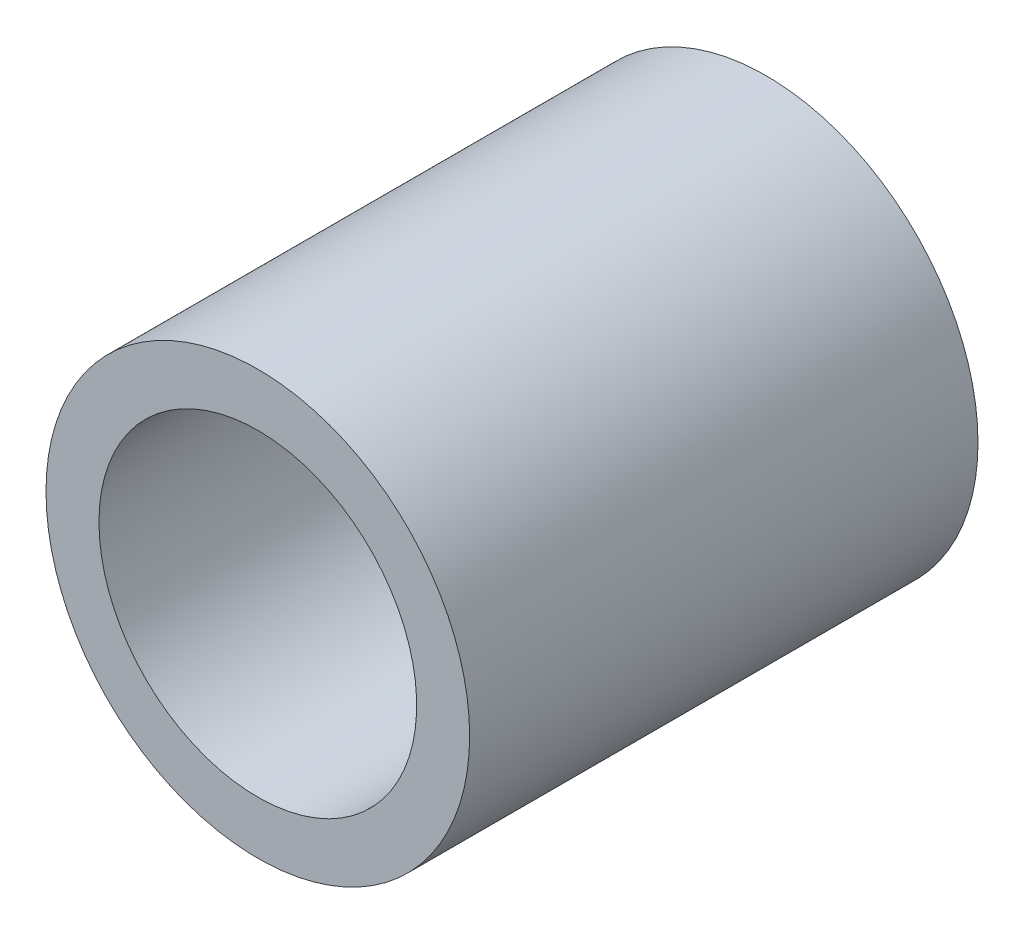
ISO-10303-21;
HEADER;
FILE_DESCRIPTION(('STEP AP214'),'2;1');
FILE_NAME('part.step','',(''),(''),'','','');
FILE_SCHEMA(('AUTOMOTIVE_DESIGN { 1 0 10303 214 1 1 1 1 }'));
ENDSEC;
DATA;
#1=APPLICATION_CONTEXT('core data for automotive mechanical design processes');
#2=APPLICATION_PROTOCOL_DEFINITION('international standard','automotive_design',2000,#1);
#3=PRODUCT_CONTEXT('',#1,'mechanical');
#4=PRODUCT('Part','Part','',(#3));
#5=PRODUCT_RELATED_PRODUCT_CATEGORY('part','',(#4));
#6=PRODUCT_DEFINITION_FORMATION('','',#4);
#7=PRODUCT_DEFINITION_CONTEXT('part definition',#1,'design');
#8=PRODUCT_DEFINITION('design','',#6,#7);
#9=PRODUCT_DEFINITION_SHAPE('','',#8);
#10=(LENGTH_UNIT() NAMED_UNIT(*) SI_UNIT(.MILLI.,.METRE.));
#11=(NAMED_UNIT(*) PLANE_ANGLE_UNIT() SI_UNIT($,.RADIAN.));
#12=(NAMED_UNIT(*) SI_UNIT($,.STERADIAN.) SOLID_ANGLE_UNIT());
#13=UNCERTAINTY_MEASURE_WITH_UNIT(LENGTH_MEASURE(1.E-05),#10,'distance_accuracy_value','');
#14=(GEOMETRIC_REPRESENTATION_CONTEXT(3) GLOBAL_UNCERTAINTY_ASSIGNED_CONTEXT((#13)) GLOBAL_UNIT_ASSIGNED_CONTEXT((#10,
#11,#12)) REPRESENTATION_CONTEXT('',''));
#15=CARTESIAN_POINT('',(0.,0.,0.));
#16=DIRECTION('',(0.,0.,1.));
#17=DIRECTION('',(1.,0.,0.));
#18=AXIS2_PLACEMENT_3D('',#15,#16,#17);
#19=CARTESIAN_POINT('',(0.,0.,6.096));
#20=DIRECTION('',(0.,0.,1.));
#21=DIRECTION('',(1.,0.,0.));
#22=AXIS2_PLACEMENT_3D('',#19,#20,#21);
#23=PLANE('',#22);
#24=CARTESIAN_POINT('',(0.,0.,6.096));
#25=DIRECTION('',(0.,0.,1.));
#26=DIRECTION('',(1.,0.,0.));
#27=AXIS2_PLACEMENT_3D('',#24,#25,#26);
#28=CIRCLE('',#27,2.54);
#29=CARTESIAN_POINT('',(-2.54,0.,6.096));
#30=VERTEX_POINT('',#29);
#31=EDGE_CURVE('E10',#30,#30,#28,.T.);
#32=ORIENTED_EDGE('',*,*,#31,.T.);
#33=EDGE_LOOP('',(#32));
#34=FACE_BOUND('',#33,.T.);
#35=CARTESIAN_POINT('',(0.,0.,6.096));
#36=DIRECTION('',(0.,0.,1.));
#37=DIRECTION('',(1.,0.,0.));
#38=AXIS2_PLACEMENT_3D('',#35,#36,#37);
#39=CIRCLE('',#38,1.905);
#40=CARTESIAN_POINT('',(-1.905,0.,6.096));
#41=VERTEX_POINT('',#40);
#42=EDGE_CURVE('E48',#41,#41,#39,.T.);
#43=ORIENTED_EDGE('',*,*,#42,.F.);
#44=EDGE_LOOP('',(#43));
#45=FACE_BOUND('',#44,.T.);
#46=ADVANCED_FACE('F35',(#34,#45),#23,.T.);
#47=CARTESIAN_POINT('',(0.,0.,0.));
#48=DIRECTION('',(0.,0.,1.));
#49=DIRECTION('',(1.,0.,0.));
#50=AXIS2_PLACEMENT_3D('',#47,#48,#49);
#51=PLANE('',#50);
#52=CARTESIAN_POINT('',(0.,0.,0.));
#53=DIRECTION('',(0.,0.,1.));
#54=DIRECTION('',(1.,0.,0.));
#55=AXIS2_PLACEMENT_3D('',#52,#53,#54);
#56=CIRCLE('',#55,2.54);
#57=CARTESIAN_POINT('',(-2.54,0.,0.));
#58=VERTEX_POINT('',#57);
#59=EDGE_CURVE('E39',#58,#58,#56,.T.);
#60=ORIENTED_EDGE('',*,*,#59,.F.);
#61=EDGE_LOOP('',(#60));
#62=FACE_BOUND('',#61,.T.);
#63=CARTESIAN_POINT('',(0.,0.,0.));
#64=DIRECTION('',(0.,0.,1.));
#65=DIRECTION('',(1.,0.,0.));
#66=AXIS2_PLACEMENT_3D('',#63,#64,#65);
#67=CIRCLE('',#66,1.905);
#68=CARTESIAN_POINT('',(-1.905,0.,0.));
#69=VERTEX_POINT('',#68);
#70=EDGE_CURVE('E50',#69,#69,#67,.T.);
#71=ORIENTED_EDGE('',*,*,#70,.T.);
#72=EDGE_LOOP('',(#71));
#73=FACE_BOUND('',#72,.T.);
#74=ADVANCED_FACE('F62',(#62,#73),#51,.F.);
#75=CARTESIAN_POINT('',(0.,0.,6.096));
#76=DIRECTION('',(0.,0.,-1.));
#77=DIRECTION('',(-1.,0.,0.));
#78=AXIS2_PLACEMENT_3D('',#75,#76,#77);
#79=CYLINDRICAL_SURFACE('',#78,2.54);
#80=CARTESIAN_POINT('',(-2.54,0.,6.096));
#81=CARTESIAN_POINT('',(-2.54,0.,6.0325));
#82=CARTESIAN_POINT('',(-2.54,0.,5.969));
#83=CARTESIAN_POINT('',(-2.54,0.,5.842));
#84=CARTESIAN_POINT('',(-2.54,0.,5.7785));
#85=CARTESIAN_POINT('',(-2.54,0.,5.6515));
#86=CARTESIAN_POINT('',(-2.54,0.,5.588));
#87=CARTESIAN_POINT('',(-2.54,0.,5.461));
#88=CARTESIAN_POINT('',(-2.54,0.,5.3975));
#89=CARTESIAN_POINT('',(-2.54,0.,5.2705));
#90=CARTESIAN_POINT('',(-2.54,0.,5.207));
#91=CARTESIAN_POINT('',(-2.54,0.,5.08));
#92=CARTESIAN_POINT('',(-2.54,0.,5.0165));
#93=CARTESIAN_POINT('',(-2.54,0.,4.8895));
#94=CARTESIAN_POINT('',(-2.54,0.,4.826));
#95=CARTESIAN_POINT('',(-2.54,0.,4.699));
#96=CARTESIAN_POINT('',(-2.54,0.,4.6355));
#97=CARTESIAN_POINT('',(-2.54,0.,4.5085));
#98=CARTESIAN_POINT('',(-2.54,0.,4.445));
#99=CARTESIAN_POINT('',(-2.54,0.,4.318));
#100=CARTESIAN_POINT('',(-2.54,0.,4.2545));
#101=CARTESIAN_POINT('',(-2.54,0.,4.1275));
#102=CARTESIAN_POINT('',(-2.54,0.,4.064));
#103=CARTESIAN_POINT('',(-2.54,0.,3.937));
#104=CARTESIAN_POINT('',(-2.54,0.,3.8735));
#105=CARTESIAN_POINT('',(-2.54,0.,3.7465));
#106=CARTESIAN_POINT('',(-2.54,0.,3.683));
#107=CARTESIAN_POINT('',(-2.54,0.,3.556));
#108=CARTESIAN_POINT('',(-2.54,0.,3.4925));
#109=CARTESIAN_POINT('',(-2.54,0.,3.3655));
#110=CARTESIAN_POINT('',(-2.54,0.,3.302));
#111=CARTESIAN_POINT('',(-2.54,0.,3.175));
#112=CARTESIAN_POINT('',(-2.54,0.,3.1115));
#113=CARTESIAN_POINT('',(-2.54,0.,2.9845));
#114=CARTESIAN_POINT('',(-2.54,0.,2.921));
#115=CARTESIAN_POINT('',(-2.54,0.,2.794));
#116=CARTESIAN_POINT('',(-2.54,0.,2.7305));
#117=CARTESIAN_POINT('',(-2.54,0.,2.6035));
#118=CARTESIAN_POINT('',(-2.54,0.,2.54));
#119=CARTESIAN_POINT('',(-2.54,0.,2.413));
#120=CARTESIAN_POINT('',(-2.54,0.,2.3495));
#121=CARTESIAN_POINT('',(-2.54,0.,2.2225));
#122=CARTESIAN_POINT('',(-2.54,0.,2.159));
#123=CARTESIAN_POINT('',(-2.54,0.,2.032));
#124=CARTESIAN_POINT('',(-2.54,0.,1.9685));
#125=CARTESIAN_POINT('',(-2.54,0.,1.8415));
#126=CARTESIAN_POINT('',(-2.54,0.,1.778));
#127=CARTESIAN_POINT('',(-2.54,0.,1.651));
#128=CARTESIAN_POINT('',(-2.54,0.,1.5875));
#129=CARTESIAN_POINT('',(-2.54,0.,1.4605));
#130=CARTESIAN_POINT('',(-2.54,0.,1.397));
#131=CARTESIAN_POINT('',(-2.54,0.,1.27));
#132=CARTESIAN_POINT('',(-2.54,0.,1.2065));
#133=CARTESIAN_POINT('',(-2.54,0.,1.0795));
#134=CARTESIAN_POINT('',(-2.54,0.,1.016));
#135=CARTESIAN_POINT('',(-2.54,0.,0.889));
#136=CARTESIAN_POINT('',(-2.54,0.,0.8255));
#137=CARTESIAN_POINT('',(-2.54,0.,0.6985));
#138=CARTESIAN_POINT('',(-2.54,0.,0.635));
#139=CARTESIAN_POINT('',(-2.54,0.,0.508));
#140=CARTESIAN_POINT('',(-2.54,0.,0.4445));
#141=CARTESIAN_POINT('',(-2.54,0.,0.3175));
#142=CARTESIAN_POINT('',(-2.54,0.,0.254));
#143=CARTESIAN_POINT('',(-2.54,0.,0.127));
#144=CARTESIAN_POINT('',(-2.54,0.,0.0634999999999999));
#145=CARTESIAN_POINT('',(-2.54,0.,0.));
#146=B_SPLINE_CURVE_WITH_KNOTS('',3,(#80,#81,#82,#83,#84,#85,#86,#87,#88,#89,#90,#91,#92,#93,
#94,#95,#96,#97,#98,#99,#100,#101,#102,#103,#104,#105,#106,#107,#108,#109,#110,#111,#112,#113,
#114,#115,#116,#117,#118,#119,#120,#121,#122,#123,#124,#125,#126,#127,#128,#129,#130,#131,#132,
#133,#134,#135,#136,#137,#138,#139,#140,#141,#142,#143,#144,#145),.UNSPECIFIED.,.F.,.F.,(4,2,2,
2,2,2,2,2,2,2,2,2,2,2,2,2,2,2,2,2,2,2,2,2,2,2,2,2,2,2,2,2,4),(0.,0.1905,0.380999999999999,
0.571499999999999,0.762,0.952499999999999,1.143,1.3335,1.524,1.7145,1.905,2.0955,2.286,2.4765,
2.667,2.8575,3.048,3.2385,3.429,3.6195,3.81,4.0005,4.191,4.3815,4.572,4.7625,4.953,5.1435,5.334,
5.5245,5.715,5.9055,6.096),.UNSPECIFIED.);
#147=EDGE_CURVE('BSEAM37',#30,#58,#146,.T.);
#148=ORIENTED_EDGE('',*,*,#31,.F.);
#149=ORIENTED_EDGE('',*,*,#59,.T.);
#150=ORIENTED_EDGE('',*,*,#147,.T.);
#151=ORIENTED_EDGE('',*,*,#147,.F.);
#152=EDGE_LOOP('',(#148,#150,#149,#151));
#153=FACE_BOUND('',#152,.T.);
#154=ADVANCED_FACE('F37',(#153),#79,.T.);
#155=CARTESIAN_POINT('',(0.,0.,6.096));
#156=DIRECTION('',(0.,0.,-1.));
#157=DIRECTION('',(-1.,0.,0.));
#158=AXIS2_PLACEMENT_3D('',#155,#156,#157);
#159=CYLINDRICAL_SURFACE('',#158,1.905);
#160=CARTESIAN_POINT('',(-1.905,0.,6.096));
#161=CARTESIAN_POINT('',(-1.905,0.,6.0325));
#162=CARTESIAN_POINT('',(-1.905,0.,5.969));
#163=CARTESIAN_POINT('',(-1.905,0.,5.842));
#164=CARTESIAN_POINT('',(-1.905,0.,5.7785));
#165=CARTESIAN_POINT('',(-1.905,0.,5.6515));
#166=CARTESIAN_POINT('',(-1.905,0.,5.588));
#167=CARTESIAN_POINT('',(-1.905,0.,5.461));
#168=CARTESIAN_POINT('',(-1.905,0.,5.3975));
#169=CARTESIAN_POINT('',(-1.905,0.,5.2705));
#170=CARTESIAN_POINT('',(-1.905,0.,5.207));
#171=CARTESIAN_POINT('',(-1.905,0.,5.08));
#172=CARTESIAN_POINT('',(-1.905,0.,5.0165));
#173=CARTESIAN_POINT('',(-1.905,0.,4.8895));
#174=CARTESIAN_POINT('',(-1.905,0.,4.826));
#175=CARTESIAN_POINT('',(-1.905,0.,4.699));
#176=CARTESIAN_POINT('',(-1.905,0.,4.6355));
#177=CARTESIAN_POINT('',(-1.905,0.,4.5085));
#178=CARTESIAN_POINT('',(-1.905,0.,4.445));
#179=CARTESIAN_POINT('',(-1.905,0.,4.318));
#180=CARTESIAN_POINT('',(-1.905,0.,4.2545));
#181=CARTESIAN_POINT('',(-1.905,0.,4.1275));
#182=CARTESIAN_POINT('',(-1.905,0.,4.064));
#183=CARTESIAN_POINT('',(-1.905,0.,3.937));
#184=CARTESIAN_POINT('',(-1.905,0.,3.8735));
#185=CARTESIAN_POINT('',(-1.905,0.,3.7465));
#186=CARTESIAN_POINT('',(-1.905,0.,3.683));
#187=CARTESIAN_POINT('',(-1.905,0.,3.556));
#188=CARTESIAN_POINT('',(-1.905,0.,3.4925));
#189=CARTESIAN_POINT('',(-1.905,0.,3.3655));
#190=CARTESIAN_POINT('',(-1.905,0.,3.302));
#191=CARTESIAN_POINT('',(-1.905,0.,3.175));
#192=CARTESIAN_POINT('',(-1.905,0.,3.1115));
#193=CARTESIAN_POINT('',(-1.905,0.,2.9845));
#194=CARTESIAN_POINT('',(-1.905,0.,2.921));
#195=CARTESIAN_POINT('',(-1.905,0.,2.794));
#196=CARTESIAN_POINT('',(-1.905,0.,2.7305));
#197=CARTESIAN_POINT('',(-1.905,0.,2.6035));
#198=CARTESIAN_POINT('',(-1.905,0.,2.54));
#199=CARTESIAN_POINT('',(-1.905,0.,2.413));
#200=CARTESIAN_POINT('',(-1.905,0.,2.3495));
#201=CARTESIAN_POINT('',(-1.905,0.,2.2225));
#202=CARTESIAN_POINT('',(-1.905,0.,2.159));
#203=CARTESIAN_POINT('',(-1.905,0.,2.032));
#204=CARTESIAN_POINT('',(-1.905,0.,1.9685));
#205=CARTESIAN_POINT('',(-1.905,0.,1.8415));
#206=CARTESIAN_POINT('',(-1.905,0.,1.778));
#207=CARTESIAN_POINT('',(-1.905,0.,1.651));
#208=CARTESIAN_POINT('',(-1.905,0.,1.5875));
#209=CARTESIAN_POINT('',(-1.905,0.,1.4605));
#210=CARTESIAN_POINT('',(-1.905,0.,1.397));
#211=CARTESIAN_POINT('',(-1.905,0.,1.27));
#212=CARTESIAN_POINT('',(-1.905,0.,1.2065));
#213=CARTESIAN_POINT('',(-1.905,0.,1.0795));
#214=CARTESIAN_POINT('',(-1.905,0.,1.016));
#215=CARTESIAN_POINT('',(-1.905,0.,0.889));
#216=CARTESIAN_POINT('',(-1.905,0.,0.8255));
#217=CARTESIAN_POINT('',(-1.905,0.,0.6985));
#218=CARTESIAN_POINT('',(-1.905,0.,0.635));
#219=CARTESIAN_POINT('',(-1.905,0.,0.508));
#220=CARTESIAN_POINT('',(-1.905,0.,0.4445));
#221=CARTESIAN_POINT('',(-1.905,0.,0.3175));
#222=CARTESIAN_POINT('',(-1.905,0.,0.254));
#223=CARTESIAN_POINT('',(-1.905,0.,0.127));
#224=CARTESIAN_POINT('',(-1.905,0.,0.0634999999999999));
#225=CARTESIAN_POINT('',(-1.905,0.,0.));
#226=B_SPLINE_CURVE_WITH_KNOTS('',3,(#160,#161,#162,#163,#164,#165,#166,#167,#168,#169,#170,
#171,#172,#173,#174,#175,#176,#177,#178,#179,#180,#181,#182,#183,#184,#185,#186,#187,#188,#189,
#190,#191,#192,#193,#194,#195,#196,#197,#198,#199,#200,#201,#202,#203,#204,#205,#206,#207,#208,
#209,#210,#211,#212,#213,#214,#215,#216,#217,#218,#219,#220,#221,#222,#223,#224,#225),
.UNSPECIFIED.,.F.,.F.,(4,2,2,2,2,2,2,2,2,2,2,2,2,2,2,2,2,2,2,2,2,2,2,2,2,2,2,2,2,2,2,2,4),(0.,
0.1905,0.380999999999999,0.571499999999999,0.762,0.952499999999999,1.143,1.3335,1.524,1.7145,
1.905,2.0955,2.286,2.4765,2.667,2.8575,3.048,3.2385,3.429,3.6195,3.81,4.0005,4.191,4.3815,4.572,
4.7625,4.953,5.1435,5.334,5.5245,5.715,5.9055,6.096),.UNSPECIFIED.);
#227=EDGE_CURVE('BSEAM58',#41,#69,#226,.T.);
#228=ORIENTED_EDGE('',*,*,#42,.T.);
#229=ORIENTED_EDGE('',*,*,#70,.F.);
#230=ORIENTED_EDGE('',*,*,#227,.T.);
#231=ORIENTED_EDGE('',*,*,#227,.F.);
#232=EDGE_LOOP('',(#228,#230,#229,#231));
#233=FACE_BOUND('',#232,.T.);
#234=ADVANCED_FACE('F58',(#233),#159,.F.);
#235=CLOSED_SHELL('',(#46,#74,#154,#234));
#236=MANIFOLD_SOLID_BREP('B2',#235);
#237=ADVANCED_BREP_SHAPE_REPRESENTATION('',(#18,#236),#14);
#238=SHAPE_DEFINITION_REPRESENTATION(#9,#237);
ENDSEC;
END-ISO-10303-21;
